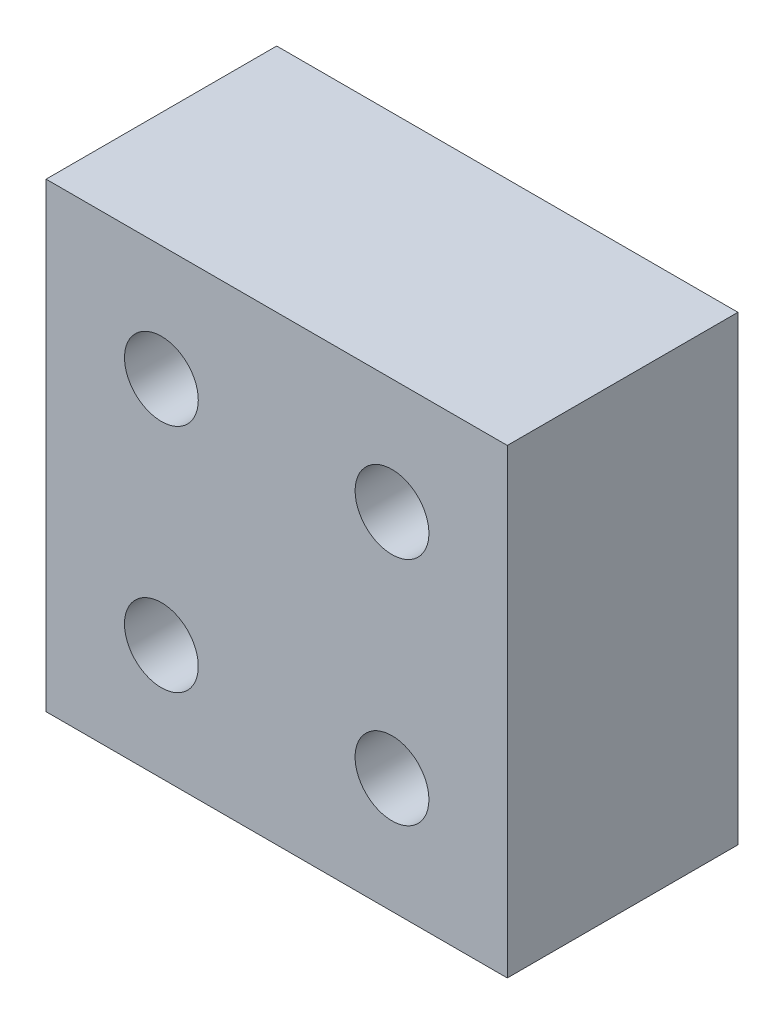
ISO-10303-21;
HEADER;
FILE_DESCRIPTION(('STEP AP214'),'2;1');
FILE_NAME('part.step','',(''),(''),'','','');
FILE_SCHEMA(('AUTOMOTIVE_DESIGN { 1 0 10303 214 1 1 1 1 }'));
ENDSEC;
DATA;
#1=APPLICATION_CONTEXT('core data for automotive mechanical design processes');
#2=APPLICATION_PROTOCOL_DEFINITION('international standard','automotive_design',2000,#1);
#3=PRODUCT_CONTEXT('',#1,'mechanical');
#4=PRODUCT('Part','Part','',(#3));
#5=PRODUCT_RELATED_PRODUCT_CATEGORY('part','',(#4));
#6=PRODUCT_DEFINITION_FORMATION('','',#4);
#7=PRODUCT_DEFINITION_CONTEXT('part definition',#1,'design');
#8=PRODUCT_DEFINITION('design','',#6,#7);
#9=PRODUCT_DEFINITION_SHAPE('','',#8);
#10=(LENGTH_UNIT() NAMED_UNIT(*) SI_UNIT(.MILLI.,.METRE.));
#11=(NAMED_UNIT(*) PLANE_ANGLE_UNIT() SI_UNIT($,.RADIAN.));
#12=(NAMED_UNIT(*) SI_UNIT($,.STERADIAN.) SOLID_ANGLE_UNIT());
#13=UNCERTAINTY_MEASURE_WITH_UNIT(LENGTH_MEASURE(1.E-05),#10,'distance_accuracy_value','');
#14=(GEOMETRIC_REPRESENTATION_CONTEXT(3) GLOBAL_UNCERTAINTY_ASSIGNED_CONTEXT((#13)) GLOBAL_UNIT_ASSIGNED_CONTEXT((#10,
#11,#12)) REPRESENTATION_CONTEXT('',''));
#15=CARTESIAN_POINT('',(0.,0.,0.));
#16=DIRECTION('',(0.,0.,1.));
#17=DIRECTION('',(1.,0.,0.));
#18=AXIS2_PLACEMENT_3D('',#15,#16,#17);
#19=CARTESIAN_POINT('',(0.,0.,10.));
#20=DIRECTION('',(1.,0.,0.));
#21=DIRECTION('',(0.,1.,0.));
#22=AXIS2_PLACEMENT_3D('',#19,#20,#21);
#23=PLANE('',#22);
#24=DIRECTION('',(0.,-1.,0.));
#25=VECTOR('',#24,1.);
#26=CARTESIAN_POINT('',(0.,0.,0.));
#27=LINE('',#26,#25);
#28=CARTESIAN_POINT('',(0.,0.,0.));
#29=VERTEX_POINT('',#28);
#30=CARTESIAN_POINT('',(0.,-20.,0.));
#31=VERTEX_POINT('',#30);
#32=EDGE_CURVE('E111',#29,#31,#27,.T.);
#33=ORIENTED_EDGE('',*,*,#32,.T.);
#34=DIRECTION('',(0.,0.,-1.));
#35=VECTOR('',#34,1.);
#36=CARTESIAN_POINT('',(0.,-20.,10.));
#37=LINE('',#36,#35);
#38=CARTESIAN_POINT('',(0.,-20.,10.));
#39=VERTEX_POINT('',#38);
#40=EDGE_CURVE('E11',#39,#31,#37,.T.);
#41=ORIENTED_EDGE('',*,*,#40,.F.);
#42=DIRECTION('',(0.,-1.,0.));
#43=VECTOR('',#42,1.);
#44=CARTESIAN_POINT('',(0.,0.,10.));
#45=LINE('',#44,#43);
#46=CARTESIAN_POINT('',(0.,0.,10.));
#47=VERTEX_POINT('',#46);
#48=EDGE_CURVE('E95',#47,#39,#45,.T.);
#49=ORIENTED_EDGE('',*,*,#48,.F.);
#50=DIRECTION('',(0.,0.,-1.));
#51=VECTOR('',#50,1.);
#52=CARTESIAN_POINT('',(0.,0.,10.));
#53=LINE('',#52,#51);
#54=EDGE_CURVE('E107',#47,#29,#53,.T.);
#55=ORIENTED_EDGE('',*,*,#54,.T.);
#56=EDGE_LOOP('',(#33,#41,#49,#55));
#57=FACE_BOUND('',#56,.T.);
#58=ADVANCED_FACE('F43',(#57),#23,.F.);
#59=CARTESIAN_POINT('',(0.,-20.,10.));
#60=DIRECTION('',(0.,1.,0.));
#61=DIRECTION('',(0.,0.,1.));
#62=AXIS2_PLACEMENT_3D('',#59,#60,#61);
#63=PLANE('',#62);
#64=DIRECTION('',(1.,0.,0.));
#65=VECTOR('',#64,1.);
#66=CARTESIAN_POINT('',(0.,-20.,0.));
#67=LINE('',#66,#65);
#68=CARTESIAN_POINT('',(20.,-20.,0.));
#69=VERTEX_POINT('',#68);
#70=EDGE_CURVE('E100',#31,#69,#67,.T.);
#71=ORIENTED_EDGE('',*,*,#70,.T.);
#72=DIRECTION('',(0.,0.,-1.));
#73=VECTOR('',#72,1.);
#74=CARTESIAN_POINT('',(20.,-20.,10.));
#75=LINE('',#74,#73);
#76=CARTESIAN_POINT('',(20.,-20.,10.));
#77=VERTEX_POINT('',#76);
#78=EDGE_CURVE('E52',#77,#69,#75,.T.);
#79=ORIENTED_EDGE('',*,*,#78,.F.);
#80=DIRECTION('',(1.,0.,0.));
#81=VECTOR('',#80,1.);
#82=CARTESIAN_POINT('',(0.,-20.,10.));
#83=LINE('',#82,#81);
#84=EDGE_CURVE('E90',#39,#77,#83,.T.);
#85=ORIENTED_EDGE('',*,*,#84,.F.);
#86=ORIENTED_EDGE('',*,*,#40,.T.);
#87=EDGE_LOOP('',(#71,#79,#85,#86));
#88=FACE_BOUND('',#87,.T.);
#89=ADVANCED_FACE('F99',(#88),#63,.F.);
#90=CARTESIAN_POINT('',(20.,0.,10.));
#91=DIRECTION('',(-1.,0.,0.));
#92=DIRECTION('',(0.,0.,1.));
#93=AXIS2_PLACEMENT_3D('',#90,#91,#92);
#94=PLANE('',#93);
#95=DIRECTION('',(0.,1.,0.));
#96=VECTOR('',#95,1.);
#97=CARTESIAN_POINT('',(20.,0.,0.));
#98=LINE('',#97,#96);
#99=CARTESIAN_POINT('',(20.,0.,0.));
#100=VERTEX_POINT('',#99);
#101=EDGE_CURVE('E77',#69,#100,#98,.T.);
#102=ORIENTED_EDGE('',*,*,#101,.T.);
#103=DIRECTION('',(0.,0.,-1.));
#104=VECTOR('',#103,1.);
#105=CARTESIAN_POINT('',(20.,0.,10.));
#106=LINE('',#105,#104);
#107=CARTESIAN_POINT('',(20.,0.,10.));
#108=VERTEX_POINT('',#107);
#109=EDGE_CURVE('E102',#108,#100,#106,.T.);
#110=ORIENTED_EDGE('',*,*,#109,.F.);
#111=DIRECTION('',(0.,1.,0.));
#112=VECTOR('',#111,1.);
#113=CARTESIAN_POINT('',(20.,0.,10.));
#114=LINE('',#113,#112);
#115=EDGE_CURVE('E93',#77,#108,#114,.T.);
#116=ORIENTED_EDGE('',*,*,#115,.F.);
#117=ORIENTED_EDGE('',*,*,#78,.T.);
#118=EDGE_LOOP('',(#102,#110,#116,#117));
#119=FACE_BOUND('',#118,.T.);
#120=ADVANCED_FACE('F103',(#119),#94,.F.);
#121=CARTESIAN_POINT('',(0.,0.,10.));
#122=DIRECTION('',(0.,-1.,0.));
#123=DIRECTION('',(0.,0.,-1.));
#124=AXIS2_PLACEMENT_3D('',#121,#122,#123);
#125=PLANE('',#124);
#126=DIRECTION('',(-1.,0.,0.));
#127=VECTOR('',#126,1.);
#128=CARTESIAN_POINT('',(0.,0.,0.));
#129=LINE('',#128,#127);
#130=EDGE_CURVE('E83',#100,#29,#129,.T.);
#131=ORIENTED_EDGE('',*,*,#130,.T.);
#132=ORIENTED_EDGE('',*,*,#54,.F.);
#133=DIRECTION('',(-1.,0.,0.));
#134=VECTOR('',#133,1.);
#135=CARTESIAN_POINT('',(0.,0.,10.));
#136=LINE('',#135,#134);
#137=EDGE_CURVE('E60',#108,#47,#136,.T.);
#138=ORIENTED_EDGE('',*,*,#137,.F.);
#139=ORIENTED_EDGE('',*,*,#109,.T.);
#140=EDGE_LOOP('',(#131,#132,#138,#139));
#141=FACE_BOUND('',#140,.T.);
#142=ADVANCED_FACE('F125',(#141),#125,.F.);
#143=CARTESIAN_POINT('',(0.,0.,10.));
#144=DIRECTION('',(0.,0.,1.));
#145=DIRECTION('',(1.,0.,0.));
#146=AXIS2_PLACEMENT_3D('',#143,#144,#145);
#147=PLANE('',#146);
#148=CARTESIAN_POINT('',(5.,-15.,10.));
#149=DIRECTION('',(0.,0.,1.));
#150=DIRECTION('',(-1.,0.,0.));
#151=AXIS2_PLACEMENT_3D('',#148,#149,#150);
#152=CIRCLE('',#151,1.6);
#153=CARTESIAN_POINT('',(3.4,-15.,10.));
#154=VERTEX_POINT('',#153);
#155=EDGE_CURVE('E144',#154,#154,#152,.T.);
#156=ORIENTED_EDGE('',*,*,#155,.F.);
#157=EDGE_LOOP('',(#156));
#158=FACE_BOUND('',#157,.T.);
#159=CARTESIAN_POINT('',(15.,-15.,10.));
#160=DIRECTION('',(0.,0.,1.));
#161=DIRECTION('',(1.,0.,0.));
#162=AXIS2_PLACEMENT_3D('',#159,#160,#161);
#163=CIRCLE('',#162,1.6);
#164=CARTESIAN_POINT('',(16.6,-15.,10.));
#165=VERTEX_POINT('',#164);
#166=EDGE_CURVE('E152',#165,#165,#163,.T.);
#167=ORIENTED_EDGE('',*,*,#166,.F.);
#168=EDGE_LOOP('',(#167));
#169=FACE_BOUND('',#168,.T.);
#170=CARTESIAN_POINT('',(15.,-5.,10.));
#171=DIRECTION('',(0.,0.,1.));
#172=DIRECTION('',(-1.,0.,0.));
#173=AXIS2_PLACEMENT_3D('',#170,#171,#172);
#174=CIRCLE('',#173,1.6);
#175=CARTESIAN_POINT('',(13.4,-5.,10.));
#176=VERTEX_POINT('',#175);
#177=EDGE_CURVE('E136',#176,#176,#174,.T.);
#178=ORIENTED_EDGE('',*,*,#177,.F.);
#179=EDGE_LOOP('',(#178));
#180=FACE_BOUND('',#179,.T.);
#181=CARTESIAN_POINT('',(5.,-5.,10.));
#182=DIRECTION('',(0.,0.,1.));
#183=DIRECTION('',(1.,0.,0.));
#184=AXIS2_PLACEMENT_3D('',#181,#182,#183);
#185=CIRCLE('',#184,1.6);
#186=CARTESIAN_POINT('',(6.6,-5.,10.));
#187=VERTEX_POINT('',#186);
#188=EDGE_CURVE('E132',#187,#187,#185,.T.);
#189=ORIENTED_EDGE('',*,*,#188,.F.);
#190=EDGE_LOOP('',(#189));
#191=FACE_BOUND('',#190,.T.);
#192=ORIENTED_EDGE('',*,*,#48,.T.);
#193=ORIENTED_EDGE('',*,*,#84,.T.);
#194=ORIENTED_EDGE('',*,*,#115,.T.);
#195=ORIENTED_EDGE('',*,*,#137,.T.);
#196=EDGE_LOOP('',(#192,#193,#194,#195));
#197=FACE_BOUND('',#196,.T.);
#198=ADVANCED_FACE('F91',(#158,#169,#180,#191,#197),#147,.T.);
#199=CARTESIAN_POINT('',(0.,0.,0.));
#200=DIRECTION('',(0.,0.,1.));
#201=DIRECTION('',(1.,0.,0.));
#202=AXIS2_PLACEMENT_3D('',#199,#200,#201);
#203=PLANE('',#202);
#204=CARTESIAN_POINT('',(5.,-15.,0.));
#205=DIRECTION('',(0.,0.,1.));
#206=DIRECTION('',(-1.,0.,0.));
#207=AXIS2_PLACEMENT_3D('',#204,#205,#206);
#208=CIRCLE('',#207,1.6);
#209=CARTESIAN_POINT('',(3.4,-15.,0.));
#210=VERTEX_POINT('',#209);
#211=EDGE_CURVE('E140',#210,#210,#208,.T.);
#212=ORIENTED_EDGE('',*,*,#211,.T.);
#213=EDGE_LOOP('',(#212));
#214=FACE_BOUND('',#213,.T.);
#215=CARTESIAN_POINT('',(15.,-15.,0.));
#216=DIRECTION('',(0.,0.,1.));
#217=DIRECTION('',(1.,0.,0.));
#218=AXIS2_PLACEMENT_3D('',#215,#216,#217);
#219=CIRCLE('',#218,1.6);
#220=CARTESIAN_POINT('',(16.6,-15.,0.));
#221=VERTEX_POINT('',#220);
#222=EDGE_CURVE('E148',#221,#221,#219,.T.);
#223=ORIENTED_EDGE('',*,*,#222,.T.);
#224=EDGE_LOOP('',(#223));
#225=FACE_BOUND('',#224,.T.);
#226=CARTESIAN_POINT('',(15.,-5.,0.));
#227=DIRECTION('',(0.,0.,1.));
#228=DIRECTION('',(-1.,0.,0.));
#229=AXIS2_PLACEMENT_3D('',#226,#227,#228);
#230=CIRCLE('',#229,1.6);
#231=CARTESIAN_POINT('',(13.4,-5.,0.));
#232=VERTEX_POINT('',#231);
#233=EDGE_CURVE('E156',#232,#232,#230,.T.);
#234=ORIENTED_EDGE('',*,*,#233,.T.);
#235=EDGE_LOOP('',(#234));
#236=FACE_BOUND('',#235,.T.);
#237=CARTESIAN_POINT('',(5.,-5.,0.));
#238=DIRECTION('',(0.,0.,1.));
#239=DIRECTION('',(1.,0.,0.));
#240=AXIS2_PLACEMENT_3D('',#237,#238,#239);
#241=CIRCLE('',#240,1.6);
#242=CARTESIAN_POINT('',(6.6,-5.,0.));
#243=VERTEX_POINT('',#242);
#244=EDGE_CURVE('E115',#243,#243,#241,.T.);
#245=ORIENTED_EDGE('',*,*,#244,.T.);
#246=EDGE_LOOP('',(#245));
#247=FACE_BOUND('',#246,.T.);
#248=ORIENTED_EDGE('',*,*,#32,.F.);
#249=ORIENTED_EDGE('',*,*,#130,.F.);
#250=ORIENTED_EDGE('',*,*,#101,.F.);
#251=ORIENTED_EDGE('',*,*,#70,.F.);
#252=EDGE_LOOP('',(#248,#249,#250,#251));
#253=FACE_BOUND('',#252,.T.);
#254=ADVANCED_FACE('F128',(#214,#225,#236,#247,#253),#203,.F.);
#255=CARTESIAN_POINT('',(5.,-5.,0.));
#256=DIRECTION('',(0.,0.,1.));
#257=DIRECTION('',(1.,0.,0.));
#258=AXIS2_PLACEMENT_3D('',#255,#256,#257);
#259=CYLINDRICAL_SURFACE('',#258,1.6);
#260=ORIENTED_EDGE('',*,*,#244,.F.);
#261=EDGE_LOOP('',(#260));
#262=FACE_BOUND('',#261,.T.);
#263=ORIENTED_EDGE('',*,*,#188,.T.);
#264=EDGE_LOOP('',(#263));
#265=FACE_BOUND('',#264,.T.);
#266=ADVANCED_FACE('F172',(#262,#265),#259,.F.);
#267=CARTESIAN_POINT('',(15.,-5.,0.));
#268=DIRECTION('',(0.,0.,1.));
#269=DIRECTION('',(1.,0.,0.));
#270=AXIS2_PLACEMENT_3D('',#267,#268,#269);
#271=CYLINDRICAL_SURFACE('',#270,1.6);
#272=ORIENTED_EDGE('',*,*,#233,.F.);
#273=EDGE_LOOP('',(#272));
#274=FACE_BOUND('',#273,.T.);
#275=ORIENTED_EDGE('',*,*,#177,.T.);
#276=EDGE_LOOP('',(#275));
#277=FACE_BOUND('',#276,.T.);
#278=ADVANCED_FACE('F164',(#274,#277),#271,.F.);
#279=CARTESIAN_POINT('',(15.,-15.,0.));
#280=DIRECTION('',(0.,0.,1.));
#281=DIRECTION('',(1.,0.,0.));
#282=AXIS2_PLACEMENT_3D('',#279,#280,#281);
#283=CYLINDRICAL_SURFACE('',#282,1.6);
#284=ORIENTED_EDGE('',*,*,#222,.F.);
#285=EDGE_LOOP('',(#284));
#286=FACE_BOUND('',#285,.T.);
#287=ORIENTED_EDGE('',*,*,#166,.T.);
#288=EDGE_LOOP('',(#287));
#289=FACE_BOUND('',#288,.T.);
#290=ADVANCED_FACE('F180',(#286,#289),#283,.F.);
#291=CARTESIAN_POINT('',(5.,-15.,0.));
#292=DIRECTION('',(0.,0.,1.));
#293=DIRECTION('',(1.,0.,0.));
#294=AXIS2_PLACEMENT_3D('',#291,#292,#293);
#295=CYLINDRICAL_SURFACE('',#294,1.6);
#296=ORIENTED_EDGE('',*,*,#211,.F.);
#297=EDGE_LOOP('',(#296));
#298=FACE_BOUND('',#297,.T.);
#299=ORIENTED_EDGE('',*,*,#155,.T.);
#300=EDGE_LOOP('',(#299));
#301=FACE_BOUND('',#300,.T.);
#302=ADVANCED_FACE('F231',(#298,#301),#295,.F.);
#303=CLOSED_SHELL('',(#58,#89,#120,#142,#198,#254,#266,#278,#290,#302));
#304=MANIFOLD_SOLID_BREP('B2',#303);
#305=ADVANCED_BREP_SHAPE_REPRESENTATION('',(#18,#304),#14);
#306=SHAPE_DEFINITION_REPRESENTATION(#9,#305);
ENDSEC;
END-ISO-10303-21;
